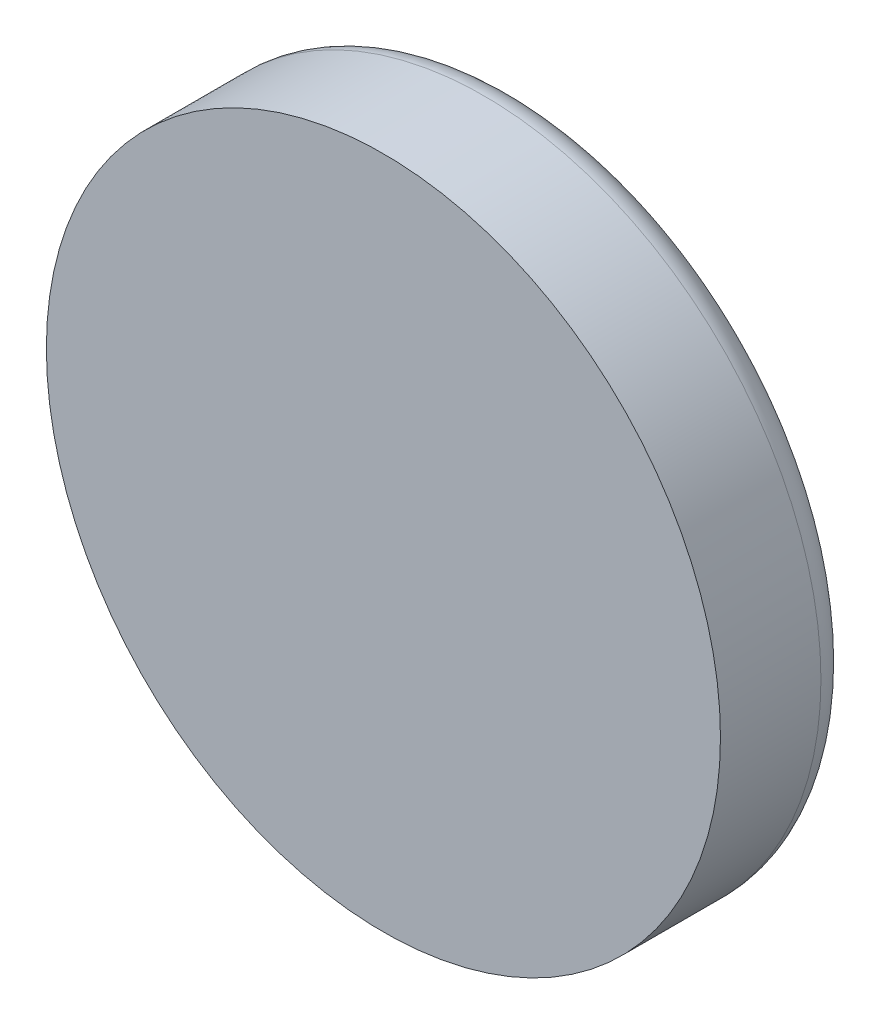
ISO-10303-21;
HEADER;
FILE_DESCRIPTION(('STEP AP214'),'2;1');
FILE_NAME('part.step','',(''),(''),'','','');
FILE_SCHEMA(('AUTOMOTIVE_DESIGN { 1 0 10303 214 1 1 1 1 }'));
ENDSEC;
DATA;
#1=APPLICATION_CONTEXT('core data for automotive mechanical design processes');
#2=APPLICATION_PROTOCOL_DEFINITION('international standard','automotive_design',2000,#1);
#3=PRODUCT_CONTEXT('',#1,'mechanical');
#4=PRODUCT('Part','Part','',(#3));
#5=PRODUCT_RELATED_PRODUCT_CATEGORY('part','',(#4));
#6=PRODUCT_DEFINITION_FORMATION('','',#4);
#7=PRODUCT_DEFINITION_CONTEXT('part definition',#1,'design');
#8=PRODUCT_DEFINITION('design','',#6,#7);
#9=PRODUCT_DEFINITION_SHAPE('','',#8);
#10=(LENGTH_UNIT() NAMED_UNIT(*) SI_UNIT(.MILLI.,.METRE.));
#11=(NAMED_UNIT(*) PLANE_ANGLE_UNIT() SI_UNIT($,.RADIAN.));
#12=(NAMED_UNIT(*) SI_UNIT($,.STERADIAN.) SOLID_ANGLE_UNIT());
#13=UNCERTAINTY_MEASURE_WITH_UNIT(LENGTH_MEASURE(1.E-05),#10,'distance_accuracy_value','');
#14=(GEOMETRIC_REPRESENTATION_CONTEXT(3) GLOBAL_UNCERTAINTY_ASSIGNED_CONTEXT((#13)) GLOBAL_UNIT_ASSIGNED_CONTEXT((#10,
#11,#12)) REPRESENTATION_CONTEXT('',''));
#15=CARTESIAN_POINT('',(0.,0.,0.));
#16=DIRECTION('',(0.,0.,1.));
#17=DIRECTION('',(1.,0.,0.));
#18=AXIS2_PLACEMENT_3D('',#15,#16,#17);
#19=CARTESIAN_POINT('',(98.5561265199217,33.3375,-25.3999999999999));
#20=DIRECTION('',(0.,0.,-1.));
#21=DIRECTION('',(-1.,0.,0.));
#22=AXIS2_PLACEMENT_3D('',#19,#20,#21);
#23=PLANE('',#22);
#24=CARTESIAN_POINT('',(98.5561265199217,33.3375,-25.3999999999999));
#25=DIRECTION('',(0.,0.,1.));
#26=DIRECTION('',(1.,0.,0.));
#27=AXIS2_PLACEMENT_3D('',#24,#25,#26);
#28=CIRCLE('',#27,17.4625);
#29=CARTESIAN_POINT('',(116.018626519922,33.3375,-25.3999999999999));
#30=VERTEX_POINT('',#29);
#31=EDGE_CURVE('E11',#30,#30,#28,.T.);
#32=ORIENTED_EDGE('',*,*,#31,.T.);
#33=EDGE_LOOP('',(#32));
#34=FACE_BOUND('',#33,.T.);
#35=ADVANCED_FACE('F32',(#34),#23,.F.);
#36=CARTESIAN_POINT('',(98.5561265199217,33.3375,-25.3999999999999));
#37=DIRECTION('',(0.,0.,1.));
#38=DIRECTION('',(1.,0.,0.));
#39=AXIS2_PLACEMENT_3D('',#36,#37,#38);
#40=CYLINDRICAL_SURFACE('',#39,17.4625);
#41=ORIENTED_EDGE('',*,*,#31,.F.);
#42=EDGE_LOOP('',(#41));
#43=FACE_BOUND('',#42,.T.);
#44=CARTESIAN_POINT('',(98.5561265199217,33.3375,-30.6056891937164));
#45=DIRECTION('',(0.,0.,1.));
#46=DIRECTION('',(1.,0.,0.));
#47=AXIS2_PLACEMENT_3D('',#44,#45,#46);
#48=CIRCLE('',#47,17.4625);
#49=CARTESIAN_POINT('',(116.018626519922,33.3375,-30.6056891937164));
#50=VERTEX_POINT('',#49);
#51=EDGE_CURVE('E38',#50,#50,#48,.T.);
#52=ORIENTED_EDGE('',*,*,#51,.T.);
#53=EDGE_LOOP('',(#52));
#54=FACE_BOUND('',#53,.T.);
#55=ADVANCED_FACE('F49',(#43,#54),#40,.T.);
#56=CARTESIAN_POINT('',(98.5561265199217,33.3375,-30.6056891937164));
#57=DIRECTION('',(0.,0.,1.));
#58=DIRECTION('',(1.,0.,0.));
#59=AXIS2_PLACEMENT_3D('',#56,#57,#58);
#60=TOROIDAL_SURFACE('',#59,15.875,1.5875);
#61=ORIENTED_EDGE('',*,*,#51,.F.);
#62=EDGE_LOOP('',(#61));
#63=FACE_BOUND('',#62,.T.);
#64=CARTESIAN_POINT('',(98.5561265199217,33.3375,-32.1166818420922));
#65=DIRECTION('',(0.,0.,1.));
#66=DIRECTION('',(1.,0.,0.));
#67=AXIS2_PLACEMENT_3D('',#64,#65,#66);
#68=CIRCLE('',#67,16.3618854758095);
#69=CARTESIAN_POINT('',(114.918011995731,33.3375,-32.1166818420922));
#70=VERTEX_POINT('',#69);
#71=EDGE_CURVE('E63',#70,#70,#68,.T.);
#72=ORIENTED_EDGE('',*,*,#71,.T.);
#73=EDGE_LOOP('',(#72));
#74=FACE_BOUND('',#73,.T.);
#75=ADVANCED_FACE('F43',(#63,#74),#60,.T.);
#76=CARTESIAN_POINT('',(96.8970544316382,33.3375,23.8092714855591));
#77=DIRECTION('',(0.,-1.,0.));
#78=DIRECTION('',(1.,0.,0.));
#79=AXIS2_PLACEMENT_3D('',#76,#77,#78);
#80=CIRCLE('',#79,58.7576987903158);
#81=TRIMMED_CURVE('',#80,(PARAMETER_VALUE(-1.54255674876444)),
(PARAMETER_VALUE(1.54255674876444)),.T.,.PARAMETER.);
#82=CARTESIAN_POINT('',(98.5561265199217,33.3375,23.8092714855591));
#83=DIRECTION('',(0.,0.,1.));
#84=AXIS1_PLACEMENT('',#82,#83);
#85=SURFACE_OF_REVOLUTION('',#81,#84);
#86=ORIENTED_EDGE('',*,*,#71,.F.);
#87=EDGE_LOOP('',(#86));
#88=FACE_BOUND('',#87,.T.);
#89=CARTESIAN_POINT('',(98.5561265199217,33.3375,-34.9249999999999));
#90=VERTEX_POINT('',#89);
#91=VERTEX_LOOP('',#90);
#92=FACE_BOUND('',#91,.T.);
#93=ADVANCED_FACE('F41',(#88,#92),#85,.T.);
#94=CLOSED_SHELL('',(#35,#55,#75,#93));
#95=MANIFOLD_SOLID_BREP('B2',#94);
#96=ADVANCED_BREP_SHAPE_REPRESENTATION('',(#18,#95),#14);
#97=SHAPE_DEFINITION_REPRESENTATION(#9,#96);
ENDSEC;
END-ISO-10303-21;
